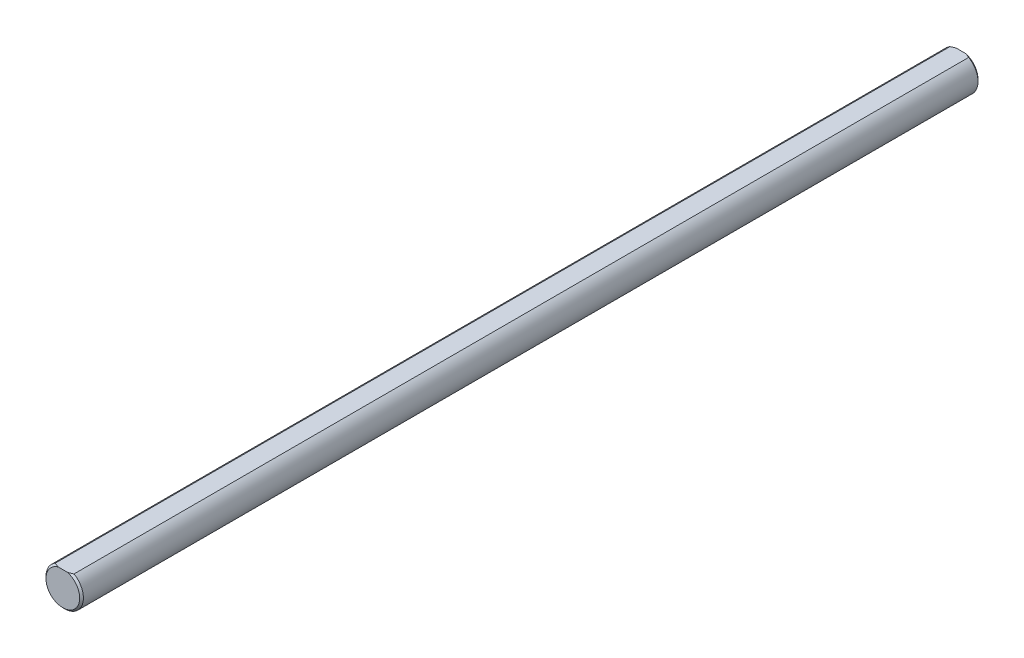
ISO-10303-21;
HEADER;
FILE_DESCRIPTION(('STEP AP214'),'2;1');
FILE_NAME('part.step','',(''),(''),'','','');
FILE_SCHEMA(('AUTOMOTIVE_DESIGN { 1 0 10303 214 1 1 1 1 }'));
ENDSEC;
DATA;
#1=APPLICATION_CONTEXT('core data for automotive mechanical design processes');
#2=APPLICATION_PROTOCOL_DEFINITION('international standard','automotive_design',2000,#1);
#3=PRODUCT_CONTEXT('',#1,'mechanical');
#4=PRODUCT('Part','Part','',(#3));
#5=PRODUCT_RELATED_PRODUCT_CATEGORY('part','',(#4));
#6=PRODUCT_DEFINITION_FORMATION('','',#4);
#7=PRODUCT_DEFINITION_CONTEXT('part definition',#1,'design');
#8=PRODUCT_DEFINITION('design','',#6,#7);
#9=PRODUCT_DEFINITION_SHAPE('','',#8);
#10=(LENGTH_UNIT() NAMED_UNIT(*) SI_UNIT(.MILLI.,.METRE.));
#11=(NAMED_UNIT(*) PLANE_ANGLE_UNIT() SI_UNIT($,.RADIAN.));
#12=(NAMED_UNIT(*) SI_UNIT($,.STERADIAN.) SOLID_ANGLE_UNIT());
#13=UNCERTAINTY_MEASURE_WITH_UNIT(LENGTH_MEASURE(1.E-05),#10,'distance_accuracy_value','');
#14=(GEOMETRIC_REPRESENTATION_CONTEXT(3) GLOBAL_UNCERTAINTY_ASSIGNED_CONTEXT((#13)) GLOBAL_UNIT_ASSIGNED_CONTEXT((#10,
#11,#12)) REPRESENTATION_CONTEXT('',''));
#15=CARTESIAN_POINT('',(0.,0.,0.));
#16=DIRECTION('',(0.,0.,1.));
#17=DIRECTION('',(1.,0.,0.));
#18=AXIS2_PLACEMENT_3D('',#15,#16,#17);
#19=CARTESIAN_POINT('',(0.,0.,152.4));
#20=DIRECTION('',(0.,0.,-1.));
#21=DIRECTION('',(-1.,0.,0.));
#22=AXIS2_PLACEMENT_3D('',#19,#20,#21);
#23=CYLINDRICAL_SURFACE('',#22,6.35);
#24=DIRECTION('',(0.,0.,1.));
#25=VECTOR('',#24,1.);
#26=CARTESIAN_POINT('',(-3.175,5.49926131403118,-152.4));
#27=LINE('',#26,#25);
#28=CARTESIAN_POINT('',(-3.175,5.49926131403118,-151.765));
#29=VERTEX_POINT('',#28);
#30=CARTESIAN_POINT('',(-3.175,5.49926131403118,151.765));
#31=VERTEX_POINT('',#30);
#32=EDGE_CURVE('E82',#29,#31,#27,.T.);
#33=ORIENTED_EDGE('',*,*,#32,.F.);
#34=CARTESIAN_POINT('',(0.,0.,-151.765));
#35=DIRECTION('',(0.,0.,1.));
#36=DIRECTION('',(1.,0.,0.));
#37=AXIS2_PLACEMENT_3D('',#34,#35,#36);
#38=CIRCLE('',#37,6.35);
#39=CARTESIAN_POINT('',(3.175,5.49926131403118,-151.765));
#40=VERTEX_POINT('',#39);
#41=EDGE_CURVE('E93',#29,#40,#38,.T.);
#42=ORIENTED_EDGE('',*,*,#41,.T.);
#43=DIRECTION('',(0.,0.,1.));
#44=VECTOR('',#43,1.);
#45=CARTESIAN_POINT('',(3.175,5.49926131403118,-152.4));
#46=LINE('',#45,#44);
#47=CARTESIAN_POINT('',(3.175,5.49926131403118,151.765));
#48=VERTEX_POINT('',#47);
#49=EDGE_CURVE('E95',#40,#48,#46,.T.);
#50=ORIENTED_EDGE('',*,*,#49,.T.);
#51=CARTESIAN_POINT('',(0.,0.,151.765));
#52=DIRECTION('',(0.,0.,1.));
#53=DIRECTION('',(1.,0.,0.));
#54=AXIS2_PLACEMENT_3D('',#51,#52,#53);
#55=CIRCLE('',#54,6.35);
#56=EDGE_CURVE('E94',#48,#31,#55,.F.);
#57=ORIENTED_EDGE('',*,*,#56,.T.);
#58=EDGE_LOOP('',(#33,#42,#50,#57));
#59=FACE_BOUND('',#58,.T.);
#60=ADVANCED_FACE('F35',(#59),#23,.T.);
#61=CARTESIAN_POINT('',(0.,0.,152.4));
#62=DIRECTION('',(0.,0.,1.));
#63=DIRECTION('',(1.,0.,0.));
#64=AXIS2_PLACEMENT_3D('',#61,#62,#63);
#65=PLANE('',#64);
#66=DIRECTION('',(1.,0.,0.));
#67=VECTOR('',#66,1.);
#68=CARTESIAN_POINT('',(-3.175,5.49926131403118,152.4));
#69=LINE('',#68,#67);
#70=CARTESIAN_POINT('',(-1.55542598666812,5.49926131403118,152.4));
#71=VERTEX_POINT('',#70);
#72=CARTESIAN_POINT('',(1.55542598666812,5.49926131403118,152.4));
#73=VERTEX_POINT('',#72);
#74=EDGE_CURVE('E140',#71,#73,#69,.T.);
#75=ORIENTED_EDGE('',*,*,#74,.F.);
#76=CARTESIAN_POINT('',(0.,0.,152.4));
#77=DIRECTION('',(0.,0.,1.));
#78=DIRECTION('',(1.,0.,0.));
#79=AXIS2_PLACEMENT_3D('',#76,#77,#78);
#80=CIRCLE('',#79,5.71500000000022);
#81=EDGE_CURVE('E11',#71,#73,#80,.T.);
#82=ORIENTED_EDGE('',*,*,#81,.T.);
#83=EDGE_LOOP('',(#75,#82));
#84=FACE_BOUND('',#83,.T.);
#85=ADVANCED_FACE('F133',(#84),#65,.T.);
#86=CARTESIAN_POINT('',(0.,0.,-152.4));
#87=DIRECTION('',(0.,0.,1.));
#88=DIRECTION('',(1.,0.,0.));
#89=AXIS2_PLACEMENT_3D('',#86,#87,#88);
#90=PLANE('',#89);
#91=DIRECTION('',(1.,0.,0.));
#92=VECTOR('',#91,1.);
#93=CARTESIAN_POINT('',(-3.175,5.49926131403118,-152.4));
#94=LINE('',#93,#92);
#95=CARTESIAN_POINT('',(-1.55542598666588,5.49926131403118,-152.4));
#96=VERTEX_POINT('',#95);
#97=CARTESIAN_POINT('',(1.55542598666588,5.49926131403118,-152.4));
#98=VERTEX_POINT('',#97);
#99=EDGE_CURVE('E84',#96,#98,#94,.T.);
#100=ORIENTED_EDGE('',*,*,#99,.T.);
#101=CARTESIAN_POINT('',(0.,0.,-152.4));
#102=DIRECTION('',(0.,0.,1.));
#103=DIRECTION('',(1.,0.,0.));
#104=AXIS2_PLACEMENT_3D('',#101,#102,#103);
#105=CIRCLE('',#104,5.71499999999961);
#106=EDGE_CURVE('E44',#98,#96,#105,.F.);
#107=ORIENTED_EDGE('',*,*,#106,.T.);
#108=EDGE_LOOP('',(#100,#107));
#109=FACE_BOUND('',#108,.T.);
#110=ADVANCED_FACE('F114',(#109),#90,.F.);
#111=CARTESIAN_POINT('',(-3.175,5.49926131403118,-152.4));
#112=DIRECTION('',(0.,-1.,0.));
#113=DIRECTION('',(0.,0.,-1.));
#114=AXIS2_PLACEMENT_3D('',#111,#112,#113);
#115=PLANE('',#114);
#116=ORIENTED_EDGE('',*,*,#49,.F.);
#117=CARTESIAN_POINT('',(3.175,5.49926131403118,-151.765));
#118=CARTESIAN_POINT('',(3.04501033398528,5.49926131403118,-151.829976164959));
#119=CARTESIAN_POINT('',(2.91380376476035,5.49926131403118,-151.892603815238));
#120=CARTESIAN_POINT('',(2.64916454153998,5.49926131403118,-152.01205170285));
#121=CARTESIAN_POINT('',(2.51573807775408,5.49926131403118,-152.068885694034));
#122=CARTESIAN_POINT('',(2.24617836004914,5.49926131403118,-152.175984011409));
#123=CARTESIAN_POINT('',(2.11004398072262,5.49926131403118,-152.226245537468));
#124=CARTESIAN_POINT('',(1.8348445135748,5.49926131403118,-152.319164391895));
#125=CARTESIAN_POINT('',(1.69577308654974,5.49926131403118,-152.361802871061));
#126=CARTESIAN_POINT('',(1.55542598666588,5.49926131403118,-152.4));
#127=B_SPLINE_CURVE_WITH_KNOTS('',3,(#117,#118,#119,#120,#121,#122,#123,#124,#125,#126),
.UNSPECIFIED.,.F.,.F.,(4,2,2,2,4),(0.,0.436005137555934,0.870949859795045,1.3060792862622,
1.74227019136261),.UNSPECIFIED.);
#128=EDGE_CURVE('E88',#40,#98,#127,.T.);
#129=ORIENTED_EDGE('',*,*,#128,.T.);
#130=ORIENTED_EDGE('',*,*,#99,.F.);
#131=CARTESIAN_POINT('',(-1.55542598666588,5.49926131403118,-152.4));
#132=CARTESIAN_POINT('',(-1.69577308654974,5.49926131403118,-152.361802871061));
#133=CARTESIAN_POINT('',(-1.8348445135748,5.49926131403118,-152.319164391895));
#134=CARTESIAN_POINT('',(-2.11004398072262,5.49926131403118,-152.226245537468));
#135=CARTESIAN_POINT('',(-2.24617836004914,5.49926131403118,-152.175984011409));
#136=CARTESIAN_POINT('',(-2.51573807775409,5.49926131403118,-152.068885694034));
#137=CARTESIAN_POINT('',(-2.64916454153998,5.49926131403118,-152.01205170285));
#138=CARTESIAN_POINT('',(-2.91380376476036,5.49926131403118,-151.892603815238));
#139=CARTESIAN_POINT('',(-3.04501033398528,5.49926131403118,-151.829976164959));
#140=CARTESIAN_POINT('',(-3.175,5.49926131403118,-151.765));
#141=B_SPLINE_CURVE_WITH_KNOTS('',3,(#131,#132,#133,#134,#135,#136,#137,#138,#139,#140),
.UNSPECIFIED.,.F.,.F.,(4,2,2,2,4),(0.,0.436190905100413,0.871320331567564,1.30626505380668,
1.74227019136261),.UNSPECIFIED.);
#142=EDGE_CURVE('E78',#96,#29,#141,.T.);
#143=ORIENTED_EDGE('',*,*,#142,.T.);
#144=ORIENTED_EDGE('',*,*,#32,.T.);
#145=CARTESIAN_POINT('',(-3.175,5.49926131403118,151.765));
#146=CARTESIAN_POINT('',(-3.04501033398546,5.49926131403118,151.82997616496));
#147=CARTESIAN_POINT('',(-2.91380376476071,5.49926131403118,151.892603815239));
#148=CARTESIAN_POINT('',(-2.6491645415407,5.49926131403118,152.01205170285));
#149=CARTESIAN_POINT('',(-2.51573807775499,5.49926131403118,152.068885694034));
#150=CARTESIAN_POINT('',(-2.24617836005042,5.49926131403118,152.175984011409));
#151=CARTESIAN_POINT('',(-2.11004398072408,5.49926131403118,152.226245537468));
#152=CARTESIAN_POINT('',(-1.83484451357664,5.49926131403118,152.319164391895));
#153=CARTESIAN_POINT('',(-1.69577308655178,5.49926131403118,152.361802871061));
#154=CARTESIAN_POINT('',(-1.55542598666812,5.49926131403118,152.4));
#155=B_SPLINE_CURVE_WITH_KNOTS('',3,(#145,#146,#147,#148,#149,#150,#151,#152,#153,#154),
.UNSPECIFIED.,.F.,.F.,(4,2,2,2,4),(0.,0.436005137555351,0.870949859793885,1.30607928626045,
1.74227019136028),.UNSPECIFIED.);
#156=EDGE_CURVE('E58',#31,#71,#155,.T.);
#157=ORIENTED_EDGE('',*,*,#156,.T.);
#158=ORIENTED_EDGE('',*,*,#74,.T.);
#159=CARTESIAN_POINT('',(1.55542598666812,5.49926131403118,152.4));
#160=CARTESIAN_POINT('',(1.69577308655178,5.49926131403118,152.361802871061));
#161=CARTESIAN_POINT('',(1.83484451357664,5.49926131403118,152.319164391895));
#162=CARTESIAN_POINT('',(2.11004398072408,5.49926131403118,152.226245537468));
#163=CARTESIAN_POINT('',(2.24617836005042,5.49926131403118,152.175984011409));
#164=CARTESIAN_POINT('',(2.51573807775499,5.49926131403118,152.068885694034));
#165=CARTESIAN_POINT('',(2.6491645415407,5.49926131403118,152.01205170285));
#166=CARTESIAN_POINT('',(2.91380376476071,5.49926131403118,151.892603815239));
#167=CARTESIAN_POINT('',(3.04501033398546,5.49926131403118,151.82997616496));
#168=CARTESIAN_POINT('',(3.175,5.49926131403118,151.765));
#169=B_SPLINE_CURVE_WITH_KNOTS('',3,(#159,#160,#161,#162,#163,#164,#165,#166,#167,#168),
.UNSPECIFIED.,.F.,.F.,(4,2,2,2,4),(0.,0.436190905099839,0.8713203315664,1.30626505380493,
1.74227019136028),.UNSPECIFIED.);
#170=EDGE_CURVE('E51',#73,#48,#169,.T.);
#171=ORIENTED_EDGE('',*,*,#170,.T.);
#172=EDGE_LOOP('',(#116,#129,#130,#143,#144,#157,#158,#171));
#173=FACE_BOUND('',#172,.T.);
#174=ADVANCED_FACE('F81',(#173),#115,.F.);
#175=CARTESIAN_POINT('',(0.,0.,-151.765));
#176=DIRECTION('',(0.,0.,1.));
#177=DIRECTION('',(1.,0.,0.));
#178=AXIS2_PLACEMENT_3D('',#175,#176,#177);
#179=CONICAL_SURFACE('',#178,6.35,0.785398163397453);
#180=ORIENTED_EDGE('',*,*,#142,.F.);
#181=ORIENTED_EDGE('',*,*,#106,.F.);
#182=ORIENTED_EDGE('',*,*,#128,.F.);
#183=ORIENTED_EDGE('',*,*,#41,.F.);
#184=EDGE_LOOP('',(#180,#181,#182,#183));
#185=FACE_BOUND('',#184,.T.);
#186=ADVANCED_FACE('F97',(#185),#179,.T.);
#187=CARTESIAN_POINT('',(0.,0.,152.4));
#188=DIRECTION('',(0.,0.,-1.));
#189=DIRECTION('',(-1.,0.,0.));
#190=AXIS2_PLACEMENT_3D('',#187,#188,#189);
#191=CONICAL_SURFACE('',#190,5.71500000000022,0.785398163397453);
#192=ORIENTED_EDGE('',*,*,#156,.F.);
#193=ORIENTED_EDGE('',*,*,#56,.F.);
#194=ORIENTED_EDGE('',*,*,#170,.F.);
#195=ORIENTED_EDGE('',*,*,#81,.F.);
#196=EDGE_LOOP('',(#192,#193,#194,#195));
#197=FACE_BOUND('',#196,.T.);
#198=ADVANCED_FACE('F37',(#197),#191,.T.);
#199=CLOSED_SHELL('',(#60,#85,#110,#174,#186,#198));
#200=MANIFOLD_SOLID_BREP('B2',#199);
#201=ADVANCED_BREP_SHAPE_REPRESENTATION('',(#18,#200),#14);
#202=SHAPE_DEFINITION_REPRESENTATION(#9,#201);
ENDSEC;
END-ISO-10303-21;
